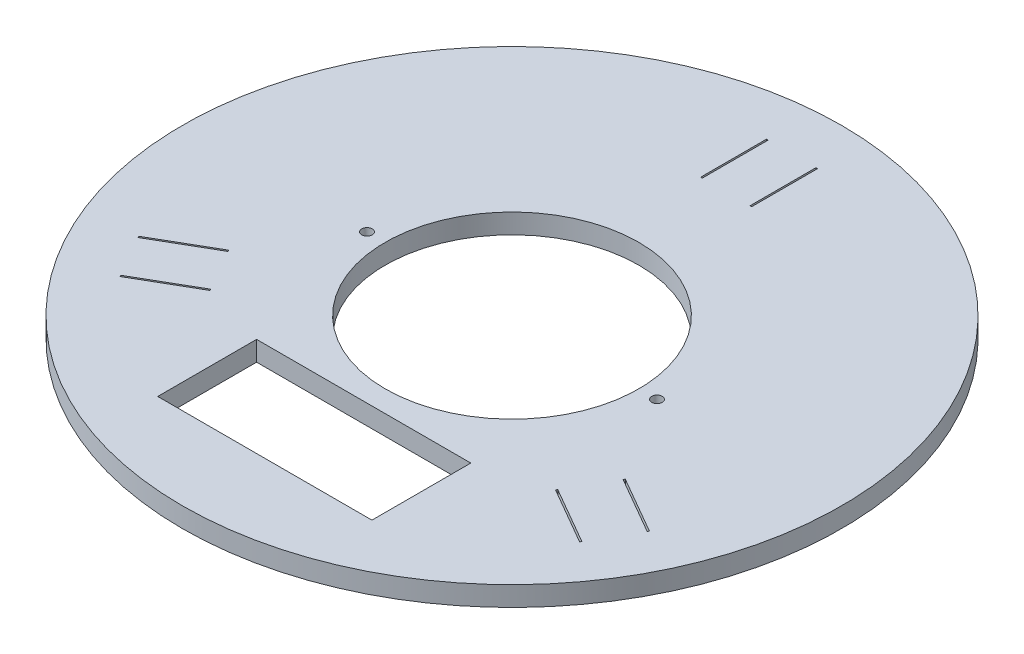
ISO-10303-21;
HEADER;
FILE_DESCRIPTION(('STEP AP214'),'2;1');
FILE_NAME('part.step','',(''),(''),'','','');
FILE_SCHEMA(('AUTOMOTIVE_DESIGN { 1 0 10303 214 1 1 1 1 }'));
ENDSEC;
DATA;
#1=APPLICATION_CONTEXT('core data for automotive mechanical design processes');
#2=APPLICATION_PROTOCOL_DEFINITION('international standard','automotive_design',2000,#1);
#3=PRODUCT_CONTEXT('',#1,'mechanical');
#4=PRODUCT('Part','Part','',(#3));
#5=PRODUCT_RELATED_PRODUCT_CATEGORY('part','',(#4));
#6=PRODUCT_DEFINITION_FORMATION('','',#4);
#7=PRODUCT_DEFINITION_CONTEXT('part definition',#1,'design');
#8=PRODUCT_DEFINITION('design','',#6,#7);
#9=PRODUCT_DEFINITION_SHAPE('','',#8);
#10=(LENGTH_UNIT() NAMED_UNIT(*) SI_UNIT(.MILLI.,.METRE.));
#11=(NAMED_UNIT(*) PLANE_ANGLE_UNIT() SI_UNIT($,.RADIAN.));
#12=(NAMED_UNIT(*) SI_UNIT($,.STERADIAN.) SOLID_ANGLE_UNIT());
#13=UNCERTAINTY_MEASURE_WITH_UNIT(LENGTH_MEASURE(1.E-05),#10,'distance_accuracy_value','');
#14=(GEOMETRIC_REPRESENTATION_CONTEXT(3) GLOBAL_UNCERTAINTY_ASSIGNED_CONTEXT((#13)) GLOBAL_UNIT_ASSIGNED_CONTEXT((#10,
#11,#12)) REPRESENTATION_CONTEXT('',''));
#15=CARTESIAN_POINT('',(0.,0.,0.));
#16=DIRECTION('',(0.,0.,1.));
#17=DIRECTION('',(1.,0.,0.));
#18=AXIS2_PLACEMENT_3D('',#15,#16,#17);
#19=CARTESIAN_POINT('',(0.,6.,0.));
#20=DIRECTION('',(0.,-1.,0.));
#21=DIRECTION('',(0.,0.,-1.));
#22=AXIS2_PLACEMENT_3D('',#19,#20,#21);
#23=CYLINDRICAL_SURFACE('',#22,100.);
#24=CARTESIAN_POINT('',(0.,6.,0.));
#25=DIRECTION('',(0.,1.,0.));
#26=DIRECTION('',(0.,0.,1.));
#27=AXIS2_PLACEMENT_3D('',#24,#25,#26);
#28=CIRCLE('',#27,100.);
#29=CARTESIAN_POINT('',(0.,6.,100.));
#30=VERTEX_POINT('',#29);
#31=EDGE_CURVE('E11',#30,#30,#28,.T.);
#32=ORIENTED_EDGE('',*,*,#31,.F.);
#33=EDGE_LOOP('',(#32));
#34=FACE_BOUND('',#33,.T.);
#35=CARTESIAN_POINT('',(0.,0.,0.));
#36=DIRECTION('',(0.,1.,0.));
#37=DIRECTION('',(0.,0.,1.));
#38=AXIS2_PLACEMENT_3D('',#35,#36,#37);
#39=CIRCLE('',#38,100.);
#40=CARTESIAN_POINT('',(0.,0.,100.));
#41=VERTEX_POINT('',#40);
#42=EDGE_CURVE('E42',#41,#41,#39,.T.);
#43=ORIENTED_EDGE('',*,*,#42,.T.);
#44=EDGE_LOOP('',(#43));
#45=FACE_BOUND('',#44,.T.);
#46=ADVANCED_FACE('F39',(#34,#45),#23,.T.);
#47=CARTESIAN_POINT('',(0.,6.,0.));
#48=DIRECTION('',(0.,1.,0.));
#49=DIRECTION('',(0.,0.,1.));
#50=AXIS2_PLACEMENT_3D('',#47,#48,#49);
#51=PLANE('',#50);
#52=DIRECTION('',(0.,0.,1.));
#53=VECTOR('',#52,1.);
#54=CARTESIAN_POINT('',(-32.5,6.,45.));
#55=LINE('',#54,#53);
#56=CARTESIAN_POINT('',(-32.5,6.,45.));
#57=VERTEX_POINT('',#56);
#58=CARTESIAN_POINT('',(-32.5,6.,75.));
#59=VERTEX_POINT('',#58);
#60=EDGE_CURVE('E53',#57,#59,#55,.T.);
#61=ORIENTED_EDGE('',*,*,#60,.F.);
#62=DIRECTION('',(-1.,0.,0.));
#63=VECTOR('',#62,1.);
#64=CARTESIAN_POINT('',(-32.5,6.,45.));
#65=LINE('',#64,#63);
#66=CARTESIAN_POINT('',(32.5,6.,45.));
#67=VERTEX_POINT('',#66);
#68=EDGE_CURVE('E241',#67,#57,#65,.T.);
#69=ORIENTED_EDGE('',*,*,#68,.F.);
#70=DIRECTION('',(0.,0.,-1.));
#71=VECTOR('',#70,1.);
#72=CARTESIAN_POINT('',(32.5,6.,45.));
#73=LINE('',#72,#71);
#74=CARTESIAN_POINT('',(32.5,6.,75.));
#75=VERTEX_POINT('',#74);
#76=EDGE_CURVE('E244',#75,#67,#73,.T.);
#77=ORIENTED_EDGE('',*,*,#76,.F.);
#78=DIRECTION('',(1.,0.,0.));
#79=VECTOR('',#78,1.);
#80=CARTESIAN_POINT('',(-32.5,6.,75.));
#81=LINE('',#80,#79);
#82=EDGE_CURVE('E250',#59,#75,#81,.T.);
#83=ORIENTED_EDGE('',*,*,#82,.F.);
#84=EDGE_LOOP('',(#61,#69,#77,#83));
#85=FACE_BOUND('',#84,.T.);
#86=CARTESIAN_POINT('',(-44.,6.,0.));
#87=DIRECTION('',(0.,1.,0.));
#88=DIRECTION('',(0.,0.,1.));
#89=AXIS2_PLACEMENT_3D('',#86,#87,#88);
#90=CIRCLE('',#89,1.6);
#91=CARTESIAN_POINT('',(-44.,6.,1.6));
#92=VERTEX_POINT('',#91);
#93=EDGE_CURVE('E264',#92,#92,#90,.T.);
#94=ORIENTED_EDGE('',*,*,#93,.F.);
#95=EDGE_LOOP('',(#94));
#96=FACE_BOUND('',#95,.T.);
#97=CARTESIAN_POINT('',(44.,6.,0.));
#98=DIRECTION('',(0.,1.,0.));
#99=DIRECTION('',(0.,0.,1.));
#100=AXIS2_PLACEMENT_3D('',#97,#98,#99);
#101=CIRCLE('',#100,1.6);
#102=CARTESIAN_POINT('',(44.,6.,1.6));
#103=VERTEX_POINT('',#102);
#104=EDGE_CURVE('E267',#103,#103,#101,.T.);
#105=ORIENTED_EDGE('',*,*,#104,.F.);
#106=EDGE_LOOP('',(#105));
#107=FACE_BOUND('',#106,.T.);
#108=CARTESIAN_POINT('',(0.,6.,0.));
#109=DIRECTION('',(0.,1.,0.));
#110=DIRECTION('',(0.,0.,1.));
#111=AXIS2_PLACEMENT_3D('',#108,#109,#110);
#112=CIRCLE('',#111,38.5);
#113=CARTESIAN_POINT('',(0.,6.,38.5));
#114=VERTEX_POINT('',#113);
#115=EDGE_CURVE('E263',#114,#114,#112,.T.);
#116=ORIENTED_EDGE('',*,*,#115,.F.);
#117=EDGE_LOOP('',(#116));
#118=FACE_BOUND('',#117,.T.);
#119=DIRECTION('',(0.,0.,-1.));
#120=VECTOR('',#119,1.);
#121=CARTESIAN_POINT('',(7.75,6.,-65.));
#122=LINE('',#121,#120);
#123=CARTESIAN_POINT('',(7.75,6.,-65.));
#124=VERTEX_POINT('',#123);
#125=CARTESIAN_POINT('',(7.75,6.,-85.));
#126=VERTEX_POINT('',#125);
#127=EDGE_CURVE('E331',#124,#126,#122,.T.);
#128=ORIENTED_EDGE('',*,*,#127,.F.);
#129=DIRECTION('',(1.,0.,0.));
#130=VECTOR('',#129,1.);
#131=CARTESIAN_POINT('',(7.25,6.,-65.));
#132=LINE('',#131,#130);
#133=CARTESIAN_POINT('',(7.25,6.,-65.));
#134=VERTEX_POINT('',#133);
#135=EDGE_CURVE('E321',#134,#124,#132,.T.);
#136=ORIENTED_EDGE('',*,*,#135,.F.);
#137=DIRECTION('',(0.,0.,1.));
#138=VECTOR('',#137,1.);
#139=CARTESIAN_POINT('',(7.25,6.,-65.));
#140=LINE('',#139,#138);
#141=CARTESIAN_POINT('',(7.25,6.,-85.));
#142=VERTEX_POINT('',#141);
#143=EDGE_CURVE('E324',#142,#134,#140,.T.);
#144=ORIENTED_EDGE('',*,*,#143,.F.);
#145=DIRECTION('',(-1.,0.,0.));
#146=VECTOR('',#145,1.);
#147=CARTESIAN_POINT('',(7.25,6.,-85.));
#148=LINE('',#147,#146);
#149=EDGE_CURVE('E328',#126,#142,#148,.T.);
#150=ORIENTED_EDGE('',*,*,#149,.F.);
#151=EDGE_LOOP('',(#128,#136,#144,#150));
#152=FACE_BOUND('',#151,.T.);
#153=DIRECTION('',(0.500000000000005,0.,-0.866025403784436));
#154=VECTOR('',#153,1.);
#155=CARTESIAN_POINT('',(77.4871593216773,6.,35.7883031206706));
#156=LINE('',#155,#154);
#157=CARTESIAN_POINT('',(77.2371593216773,6.,36.2213158225628));
#158=VERTEX_POINT('',#157);
#159=CARTESIAN_POINT('',(77.4871593216773,6.,35.7883031206706));
#160=VERTEX_POINT('',#159);
#161=EDGE_CURVE('E320',#158,#160,#156,.T.);
#162=ORIENTED_EDGE('',*,*,#161,.F.);
#163=DIRECTION('',(0.866025403784439,0.,0.5));
#164=VECTOR('',#163,1.);
#165=CARTESIAN_POINT('',(59.9166512459885,6.,26.2213158225628));
#166=LINE('',#165,#164);
#167=CARTESIAN_POINT('',(59.9166512459885,6.,26.2213158225628));
#168=VERTEX_POINT('',#167);
#169=EDGE_CURVE('E355',#168,#158,#166,.T.);
#170=ORIENTED_EDGE('',*,*,#169,.F.);
#171=DIRECTION('',(-0.500000000000005,0.,0.866025403784436));
#172=VECTOR('',#171,1.);
#173=CARTESIAN_POINT('',(60.1666512459885,6.,25.7883031206706));
#174=LINE('',#173,#172);
#175=CARTESIAN_POINT('',(60.1666512459885,6.,25.7883031206706));
#176=VERTEX_POINT('',#175);
#177=EDGE_CURVE('E358',#176,#168,#174,.T.);
#178=ORIENTED_EDGE('',*,*,#177,.F.);
#179=DIRECTION('',(-0.866025403784439,0.,-0.5));
#180=VECTOR('',#179,1.);
#181=CARTESIAN_POINT('',(60.1666512459885,6.,25.7883031206706));
#182=LINE('',#181,#180);
#183=EDGE_CURVE('E362',#160,#176,#182,.T.);
#184=ORIENTED_EDGE('',*,*,#183,.F.);
#185=EDGE_LOOP('',(#162,#170,#178,#184));
#186=FACE_BOUND('',#185,.T.);
#187=DIRECTION('',(0.499999999999998,0.,-0.866025403784439));
#188=VECTOR('',#187,1.);
#189=CARTESIAN_POINT('',(69.9871593216773,6.,48.7786841774372));
#190=LINE('',#189,#188);
#191=CARTESIAN_POINT('',(69.7371593216773,6.,49.2116968793294));
#192=VERTEX_POINT('',#191);
#193=CARTESIAN_POINT('',(69.9871593216773,6.,48.7786841774372));
#194=VERTEX_POINT('',#193);
#195=EDGE_CURVE('E354',#192,#194,#190,.T.);
#196=ORIENTED_EDGE('',*,*,#195,.F.);
#197=DIRECTION('',(0.866025403784438,0.,0.5));
#198=VECTOR('',#197,1.);
#199=CARTESIAN_POINT('',(52.4166512459885,6.,39.2116968793294));
#200=LINE('',#199,#198);
#201=CARTESIAN_POINT('',(52.4166512459885,6.,39.2116968793294));
#202=VERTEX_POINT('',#201);
#203=EDGE_CURVE('E387',#202,#192,#200,.T.);
#204=ORIENTED_EDGE('',*,*,#203,.F.);
#205=DIRECTION('',(-0.500000000000005,0.,0.866025403784436));
#206=VECTOR('',#205,1.);
#207=CARTESIAN_POINT('',(52.6666512459885,6.,38.7786841774372));
#208=LINE('',#207,#206);
#209=CARTESIAN_POINT('',(52.6666512459885,6.,38.7786841774372));
#210=VERTEX_POINT('',#209);
#211=EDGE_CURVE('E390',#210,#202,#208,.T.);
#212=ORIENTED_EDGE('',*,*,#211,.F.);
#213=DIRECTION('',(-0.866025403784439,0.,-0.5));
#214=VECTOR('',#213,1.);
#215=CARTESIAN_POINT('',(52.6666512459885,6.,38.7786841774372));
#216=LINE('',#215,#214);
#217=EDGE_CURVE('E394',#194,#210,#216,.T.);
#218=ORIENTED_EDGE('',*,*,#217,.F.);
#219=EDGE_LOOP('',(#196,#204,#212,#218));
#220=FACE_BOUND('',#219,.T.);
#221=DIRECTION('',(0.499999999999998,0.,0.866025403784439));
#222=VECTOR('',#221,1.);
#223=CARTESIAN_POINT('',(-69.7371593216772,6.,49.2116968793294));
#224=LINE('',#223,#222);
#225=CARTESIAN_POINT('',(-69.9871593216772,6.,48.7786841774372));
#226=VERTEX_POINT('',#225);
#227=CARTESIAN_POINT('',(-69.7371593216772,6.,49.2116968793294));
#228=VERTEX_POINT('',#227);
#229=EDGE_CURVE('E386',#226,#228,#224,.T.);
#230=ORIENTED_EDGE('',*,*,#229,.F.);
#231=DIRECTION('',(-0.866025403784438,0.,0.5));
#232=VECTOR('',#231,1.);
#233=CARTESIAN_POINT('',(-52.6666512459885,6.,38.7786841774372));
#234=LINE('',#233,#232);
#235=CARTESIAN_POINT('',(-52.6666512459885,6.,38.7786841774372));
#236=VERTEX_POINT('',#235);
#237=EDGE_CURVE('E417',#236,#226,#234,.T.);
#238=ORIENTED_EDGE('',*,*,#237,.F.);
#239=DIRECTION('',(-0.499999999999998,0.,-0.866025403784439));
#240=VECTOR('',#239,1.);
#241=CARTESIAN_POINT('',(-52.4166512459885,6.,39.2116968793294));
#242=LINE('',#241,#240);
#243=CARTESIAN_POINT('',(-52.4166512459885,6.,39.2116968793294));
#244=VERTEX_POINT('',#243);
#245=EDGE_CURVE('E420',#244,#236,#242,.T.);
#246=ORIENTED_EDGE('',*,*,#245,.F.);
#247=DIRECTION('',(0.866025403784438,0.,-0.5));
#248=VECTOR('',#247,1.);
#249=CARTESIAN_POINT('',(-52.4166512459885,6.,39.2116968793294));
#250=LINE('',#249,#248);
#251=EDGE_CURVE('E424',#228,#244,#250,.T.);
#252=ORIENTED_EDGE('',*,*,#251,.F.);
#253=EDGE_LOOP('',(#230,#238,#246,#252));
#254=FACE_BOUND('',#253,.T.);
#255=DIRECTION('',(0.499999999999998,0.,0.866025403784439));
#256=VECTOR('',#255,1.);
#257=CARTESIAN_POINT('',(-77.2371593216773,6.,36.2213158225629));
#258=LINE('',#257,#256);
#259=CARTESIAN_POINT('',(-77.4871593216773,6.,35.7883031206706));
#260=VERTEX_POINT('',#259);
#261=CARTESIAN_POINT('',(-77.2371593216773,6.,36.2213158225629));
#262=VERTEX_POINT('',#261);
#263=EDGE_CURVE('E297',#260,#262,#258,.T.);
#264=ORIENTED_EDGE('',*,*,#263,.F.);
#265=DIRECTION('',(-0.866025403784438,0.,0.5));
#266=VECTOR('',#265,1.);
#267=CARTESIAN_POINT('',(-60.1666512459885,6.,25.7883031206706));
#268=LINE('',#267,#266);
#269=CARTESIAN_POINT('',(-60.1666512459885,6.,25.7883031206706));
#270=VERTEX_POINT('',#269);
#271=EDGE_CURVE('E287',#270,#260,#268,.T.);
#272=ORIENTED_EDGE('',*,*,#271,.F.);
#273=DIRECTION('',(-0.500000000000005,0.,-0.866025403784436));
#274=VECTOR('',#273,1.);
#275=CARTESIAN_POINT('',(-59.9166512459885,6.,26.2213158225628));
#276=LINE('',#275,#274);
#277=CARTESIAN_POINT('',(-59.9166512459885,6.,26.2213158225628));
#278=VERTEX_POINT('',#277);
#279=EDGE_CURVE('E290',#278,#270,#276,.T.);
#280=ORIENTED_EDGE('',*,*,#279,.F.);
#281=DIRECTION('',(0.866025403784438,0.,-0.500000000000001));
#282=VECTOR('',#281,1.);
#283=CARTESIAN_POINT('',(-59.9166512459885,6.,26.2213158225628));
#284=LINE('',#283,#282);
#285=EDGE_CURVE('E294',#262,#278,#284,.T.);
#286=ORIENTED_EDGE('',*,*,#285,.F.);
#287=EDGE_LOOP('',(#264,#272,#280,#286));
#288=FACE_BOUND('',#287,.T.);
#289=DIRECTION('',(0.,0.,-1.));
#290=VECTOR('',#289,1.);
#291=CARTESIAN_POINT('',(-7.25,6.,-65.));
#292=LINE('',#291,#290);
#293=CARTESIAN_POINT('',(-7.25,6.,-65.));
#294=VERTEX_POINT('',#293);
#295=CARTESIAN_POINT('',(-7.25,6.,-85.));
#296=VERTEX_POINT('',#295);
#297=EDGE_CURVE('E333',#294,#296,#292,.T.);
#298=ORIENTED_EDGE('',*,*,#297,.F.);
#299=DIRECTION('',(1.,0.,0.));
#300=VECTOR('',#299,1.);
#301=CARTESIAN_POINT('',(-7.75,6.,-65.));
#302=LINE('',#301,#300);
#303=CARTESIAN_POINT('',(-7.75,6.,-65.));
#304=VERTEX_POINT('',#303);
#305=EDGE_CURVE('E442',#304,#294,#302,.T.);
#306=ORIENTED_EDGE('',*,*,#305,.F.);
#307=DIRECTION('',(0.,0.,1.));
#308=VECTOR('',#307,1.);
#309=CARTESIAN_POINT('',(-7.75,6.,-65.));
#310=LINE('',#309,#308);
#311=CARTESIAN_POINT('',(-7.75,6.,-85.));
#312=VERTEX_POINT('',#311);
#313=EDGE_CURVE('E456',#312,#304,#310,.T.);
#314=ORIENTED_EDGE('',*,*,#313,.F.);
#315=DIRECTION('',(-1.,0.,0.));
#316=VECTOR('',#315,1.);
#317=CARTESIAN_POINT('',(-7.75,6.,-85.));
#318=LINE('',#317,#316);
#319=EDGE_CURVE('E453',#296,#312,#318,.T.);
#320=ORIENTED_EDGE('',*,*,#319,.F.);
#321=EDGE_LOOP('',(#298,#306,#314,#320));
#322=FACE_BOUND('',#321,.T.);
#323=ORIENTED_EDGE('',*,*,#31,.T.);
#324=EDGE_LOOP('',(#323));
#325=FACE_BOUND('',#324,.T.);
#326=ADVANCED_FACE('F478',(#85,#96,#107,#118,#152,#186,#220,#254,#288,#322,#325),#51,.T.);
#327=CARTESIAN_POINT('',(0.,0.,0.));
#328=DIRECTION('',(0.,1.,0.));
#329=DIRECTION('',(0.,0.,1.));
#330=AXIS2_PLACEMENT_3D('',#327,#328,#329);
#331=PLANE('',#330);
#332=DIRECTION('',(-1.,0.,0.));
#333=VECTOR('',#332,1.);
#334=CARTESIAN_POINT('',(-32.5,0.,45.));
#335=LINE('',#334,#333);
#336=CARTESIAN_POINT('',(32.5,0.,45.));
#337=VERTEX_POINT('',#336);
#338=CARTESIAN_POINT('',(-32.5,0.,45.));
#339=VERTEX_POINT('',#338);
#340=EDGE_CURVE('E231',#337,#339,#335,.T.);
#341=ORIENTED_EDGE('',*,*,#340,.T.);
#342=DIRECTION('',(0.,0.,1.));
#343=VECTOR('',#342,1.);
#344=CARTESIAN_POINT('',(-32.5,0.,45.));
#345=LINE('',#344,#343);
#346=CARTESIAN_POINT('',(-32.5,0.,75.));
#347=VERTEX_POINT('',#346);
#348=EDGE_CURVE('E225',#339,#347,#345,.T.);
#349=ORIENTED_EDGE('',*,*,#348,.T.);
#350=DIRECTION('',(1.,0.,0.));
#351=VECTOR('',#350,1.);
#352=CARTESIAN_POINT('',(-32.5,0.,75.));
#353=LINE('',#352,#351);
#354=CARTESIAN_POINT('',(32.5,0.,75.));
#355=VERTEX_POINT('',#354);
#356=EDGE_CURVE('E234',#347,#355,#353,.T.);
#357=ORIENTED_EDGE('',*,*,#356,.T.);
#358=DIRECTION('',(0.,0.,-1.));
#359=VECTOR('',#358,1.);
#360=CARTESIAN_POINT('',(32.5,0.,45.));
#361=LINE('',#360,#359);
#362=EDGE_CURVE('E61',#355,#337,#361,.T.);
#363=ORIENTED_EDGE('',*,*,#362,.T.);
#364=EDGE_LOOP('',(#341,#349,#357,#363));
#365=FACE_BOUND('',#364,.T.);
#366=CARTESIAN_POINT('',(-44.,0.,0.));
#367=DIRECTION('',(0.,1.,0.));
#368=DIRECTION('',(0.,0.,1.));
#369=AXIS2_PLACEMENT_3D('',#366,#367,#368);
#370=CIRCLE('',#369,1.6);
#371=CARTESIAN_POINT('',(-44.,0.,1.6));
#372=VERTEX_POINT('',#371);
#373=EDGE_CURVE('E260',#372,#372,#370,.T.);
#374=ORIENTED_EDGE('',*,*,#373,.T.);
#375=EDGE_LOOP('',(#374));
#376=FACE_BOUND('',#375,.T.);
#377=CARTESIAN_POINT('',(44.,0.,0.));
#378=DIRECTION('',(0.,1.,0.));
#379=DIRECTION('',(0.,0.,1.));
#380=AXIS2_PLACEMENT_3D('',#377,#378,#379);
#381=CIRCLE('',#380,1.6);
#382=CARTESIAN_POINT('',(44.,0.,1.6));
#383=VERTEX_POINT('',#382);
#384=EDGE_CURVE('E256',#383,#383,#381,.T.);
#385=ORIENTED_EDGE('',*,*,#384,.T.);
#386=EDGE_LOOP('',(#385));
#387=FACE_BOUND('',#386,.T.);
#388=CARTESIAN_POINT('',(0.,0.,0.));
#389=DIRECTION('',(0.,1.,0.));
#390=DIRECTION('',(0.,0.,1.));
#391=AXIS2_PLACEMENT_3D('',#388,#389,#390);
#392=CIRCLE('',#391,38.5);
#393=CARTESIAN_POINT('',(0.,0.,38.5));
#394=VERTEX_POINT('',#393);
#395=EDGE_CURVE('E272',#394,#394,#392,.T.);
#396=ORIENTED_EDGE('',*,*,#395,.T.);
#397=EDGE_LOOP('',(#396));
#398=FACE_BOUND('',#397,.T.);
#399=DIRECTION('',(1.,0.,0.));
#400=VECTOR('',#399,1.);
#401=CARTESIAN_POINT('',(7.25,0.,-65.));
#402=LINE('',#401,#400);
#403=CARTESIAN_POINT('',(7.25,0.,-65.));
#404=VERTEX_POINT('',#403);
#405=CARTESIAN_POINT('',(7.75,0.,-65.));
#406=VERTEX_POINT('',#405);
#407=EDGE_CURVE('E313',#404,#406,#402,.T.);
#408=ORIENTED_EDGE('',*,*,#407,.T.);
#409=DIRECTION('',(0.,0.,-1.));
#410=VECTOR('',#409,1.);
#411=CARTESIAN_POINT('',(7.75,0.,-65.));
#412=LINE('',#411,#410);
#413=CARTESIAN_POINT('',(7.75,0.,-85.));
#414=VERTEX_POINT('',#413);
#415=EDGE_CURVE('E325',#406,#414,#412,.T.);
#416=ORIENTED_EDGE('',*,*,#415,.T.);
#417=DIRECTION('',(-1.,0.,0.));
#418=VECTOR('',#417,1.);
#419=CARTESIAN_POINT('',(7.25,0.,-85.));
#420=LINE('',#419,#418);
#421=CARTESIAN_POINT('',(7.25,0.,-85.));
#422=VERTEX_POINT('',#421);
#423=EDGE_CURVE('E339',#414,#422,#420,.T.);
#424=ORIENTED_EDGE('',*,*,#423,.T.);
#425=DIRECTION('',(0.,0.,1.));
#426=VECTOR('',#425,1.);
#427=CARTESIAN_POINT('',(7.25,0.,-65.));
#428=LINE('',#427,#426);
#429=EDGE_CURVE('E336',#422,#404,#428,.T.);
#430=ORIENTED_EDGE('',*,*,#429,.T.);
#431=EDGE_LOOP('',(#408,#416,#424,#430));
#432=FACE_BOUND('',#431,.T.);
#433=DIRECTION('',(0.866025403784439,0.,0.5));
#434=VECTOR('',#433,1.);
#435=CARTESIAN_POINT('',(59.9166512459885,0.,26.2213158225628));
#436=LINE('',#435,#434);
#437=CARTESIAN_POINT('',(59.9166512459885,0.,26.2213158225628));
#438=VERTEX_POINT('',#437);
#439=CARTESIAN_POINT('',(77.2371593216773,0.,36.2213158225628));
#440=VERTEX_POINT('',#439);
#441=EDGE_CURVE('E347',#438,#440,#436,.T.);
#442=ORIENTED_EDGE('',*,*,#441,.T.);
#443=DIRECTION('',(0.500000000000005,0.,-0.866025403784436));
#444=VECTOR('',#443,1.);
#445=CARTESIAN_POINT('',(77.4871593216773,0.,35.7883031206706));
#446=LINE('',#445,#444);
#447=CARTESIAN_POINT('',(77.4871593216773,0.,35.7883031206706));
#448=VERTEX_POINT('',#447);
#449=EDGE_CURVE('E359',#440,#448,#446,.T.);
#450=ORIENTED_EDGE('',*,*,#449,.T.);
#451=DIRECTION('',(-0.866025403784439,0.,-0.5));
#452=VECTOR('',#451,1.);
#453=CARTESIAN_POINT('',(60.1666512459885,0.,25.7883031206706));
#454=LINE('',#453,#452);
#455=CARTESIAN_POINT('',(60.1666512459885,0.,25.7883031206706));
#456=VERTEX_POINT('',#455);
#457=EDGE_CURVE('E371',#448,#456,#454,.T.);
#458=ORIENTED_EDGE('',*,*,#457,.T.);
#459=DIRECTION('',(-0.500000000000005,0.,0.866025403784436));
#460=VECTOR('',#459,1.);
#461=CARTESIAN_POINT('',(60.1666512459885,0.,25.7883031206706));
#462=LINE('',#461,#460);
#463=EDGE_CURVE('E368',#456,#438,#462,.T.);
#464=ORIENTED_EDGE('',*,*,#463,.T.);
#465=EDGE_LOOP('',(#442,#450,#458,#464));
#466=FACE_BOUND('',#465,.T.);
#467=DIRECTION('',(0.866025403784438,0.,0.5));
#468=VECTOR('',#467,1.);
#469=CARTESIAN_POINT('',(52.4166512459885,0.,39.2116968793294));
#470=LINE('',#469,#468);
#471=CARTESIAN_POINT('',(52.4166512459885,0.,39.2116968793294));
#472=VERTEX_POINT('',#471);
#473=CARTESIAN_POINT('',(69.7371593216773,0.,49.2116968793294));
#474=VERTEX_POINT('',#473);
#475=EDGE_CURVE('E379',#472,#474,#470,.T.);
#476=ORIENTED_EDGE('',*,*,#475,.T.);
#477=DIRECTION('',(0.499999999999998,0.,-0.866025403784439));
#478=VECTOR('',#477,1.);
#479=CARTESIAN_POINT('',(69.9871593216773,0.,48.7786841774372));
#480=LINE('',#479,#478);
#481=CARTESIAN_POINT('',(69.9871593216773,0.,48.7786841774372));
#482=VERTEX_POINT('',#481);
#483=EDGE_CURVE('E391',#474,#482,#480,.T.);
#484=ORIENTED_EDGE('',*,*,#483,.T.);
#485=DIRECTION('',(-0.866025403784439,0.,-0.5));
#486=VECTOR('',#485,1.);
#487=CARTESIAN_POINT('',(52.6666512459885,0.,38.7786841774372));
#488=LINE('',#487,#486);
#489=CARTESIAN_POINT('',(52.6666512459885,0.,38.7786841774372));
#490=VERTEX_POINT('',#489);
#491=EDGE_CURVE('E403',#482,#490,#488,.T.);
#492=ORIENTED_EDGE('',*,*,#491,.T.);
#493=DIRECTION('',(-0.500000000000005,0.,0.866025403784436));
#494=VECTOR('',#493,1.);
#495=CARTESIAN_POINT('',(52.6666512459885,0.,38.7786841774372));
#496=LINE('',#495,#494);
#497=EDGE_CURVE('E400',#490,#472,#496,.T.);
#498=ORIENTED_EDGE('',*,*,#497,.T.);
#499=EDGE_LOOP('',(#476,#484,#492,#498));
#500=FACE_BOUND('',#499,.T.);
#501=DIRECTION('',(-0.866025403784438,0.,0.5));
#502=VECTOR('',#501,1.);
#503=CARTESIAN_POINT('',(-52.6666512459885,0.,38.7786841774372));
#504=LINE('',#503,#502);
#505=CARTESIAN_POINT('',(-52.6666512459885,0.,38.7786841774372));
#506=VERTEX_POINT('',#505);
#507=CARTESIAN_POINT('',(-69.9871593216772,0.,48.7786841774372));
#508=VERTEX_POINT('',#507);
#509=EDGE_CURVE('E411',#506,#508,#504,.T.);
#510=ORIENTED_EDGE('',*,*,#509,.T.);
#511=DIRECTION('',(0.499999999999998,0.,0.866025403784439));
#512=VECTOR('',#511,1.);
#513=CARTESIAN_POINT('',(-69.7371593216772,0.,49.2116968793294));
#514=LINE('',#513,#512);
#515=CARTESIAN_POINT('',(-69.7371593216772,0.,49.2116968793294));
#516=VERTEX_POINT('',#515);
#517=EDGE_CURVE('E421',#508,#516,#514,.T.);
#518=ORIENTED_EDGE('',*,*,#517,.T.);
#519=DIRECTION('',(0.866025403784438,0.,-0.5));
#520=VECTOR('',#519,1.);
#521=CARTESIAN_POINT('',(-52.4166512459885,0.,39.2116968793294));
#522=LINE('',#521,#520);
#523=CARTESIAN_POINT('',(-52.4166512459885,0.,39.2116968793294));
#524=VERTEX_POINT('',#523);
#525=EDGE_CURVE('E433',#516,#524,#522,.T.);
#526=ORIENTED_EDGE('',*,*,#525,.T.);
#527=DIRECTION('',(-0.499999999999998,0.,-0.866025403784439));
#528=VECTOR('',#527,1.);
#529=CARTESIAN_POINT('',(-52.4166512459885,0.,39.2116968793294));
#530=LINE('',#529,#528);
#531=EDGE_CURVE('E430',#524,#506,#530,.T.);
#532=ORIENTED_EDGE('',*,*,#531,.T.);
#533=EDGE_LOOP('',(#510,#518,#526,#532));
#534=FACE_BOUND('',#533,.T.);
#535=DIRECTION('',(-0.866025403784438,0.,0.5));
#536=VECTOR('',#535,1.);
#537=CARTESIAN_POINT('',(-60.1666512459885,0.,25.7883031206706));
#538=LINE('',#537,#536);
#539=CARTESIAN_POINT('',(-60.1666512459885,0.,25.7883031206706));
#540=VERTEX_POINT('',#539);
#541=CARTESIAN_POINT('',(-77.4871593216773,0.,35.7883031206706));
#542=VERTEX_POINT('',#541);
#543=EDGE_CURVE('E281',#540,#542,#538,.T.);
#544=ORIENTED_EDGE('',*,*,#543,.T.);
#545=DIRECTION('',(0.499999999999998,0.,0.866025403784439));
#546=VECTOR('',#545,1.);
#547=CARTESIAN_POINT('',(-77.2371593216773,0.,36.2213158225629));
#548=LINE('',#547,#546);
#549=CARTESIAN_POINT('',(-77.2371593216773,0.,36.2213158225629));
#550=VERTEX_POINT('',#549);
#551=EDGE_CURVE('E291',#542,#550,#548,.T.);
#552=ORIENTED_EDGE('',*,*,#551,.T.);
#553=DIRECTION('',(0.866025403784438,0.,-0.500000000000001));
#554=VECTOR('',#553,1.);
#555=CARTESIAN_POINT('',(-59.9166512459885,0.,26.2213158225628));
#556=LINE('',#555,#554);
#557=CARTESIAN_POINT('',(-59.9166512459885,0.,26.2213158225628));
#558=VERTEX_POINT('',#557);
#559=EDGE_CURVE('E305',#550,#558,#556,.T.);
#560=ORIENTED_EDGE('',*,*,#559,.T.);
#561=DIRECTION('',(-0.500000000000005,0.,-0.866025403784436));
#562=VECTOR('',#561,1.);
#563=CARTESIAN_POINT('',(-59.9166512459885,0.,26.2213158225628));
#564=LINE('',#563,#562);
#565=EDGE_CURVE('E302',#558,#540,#564,.T.);
#566=ORIENTED_EDGE('',*,*,#565,.T.);
#567=EDGE_LOOP('',(#544,#552,#560,#566));
#568=FACE_BOUND('',#567,.T.);
#569=DIRECTION('',(1.,0.,0.));
#570=VECTOR('',#569,1.);
#571=CARTESIAN_POINT('',(-7.75,0.,-65.));
#572=LINE('',#571,#570);
#573=CARTESIAN_POINT('',(-7.75,0.,-65.));
#574=VERTEX_POINT('',#573);
#575=CARTESIAN_POINT('',(-7.25,0.,-65.));
#576=VERTEX_POINT('',#575);
#577=EDGE_CURVE('E448',#574,#576,#572,.T.);
#578=ORIENTED_EDGE('',*,*,#577,.T.);
#579=DIRECTION('',(0.,0.,-1.));
#580=VECTOR('',#579,1.);
#581=CARTESIAN_POINT('',(-7.25,0.,-65.));
#582=LINE('',#581,#580);
#583=CARTESIAN_POINT('',(-7.25,0.,-85.));
#584=VERTEX_POINT('',#583);
#585=EDGE_CURVE('E438',#576,#584,#582,.T.);
#586=ORIENTED_EDGE('',*,*,#585,.T.);
#587=DIRECTION('',(-1.,0.,0.));
#588=VECTOR('',#587,1.);
#589=CARTESIAN_POINT('',(-7.75,0.,-85.));
#590=LINE('',#589,#588);
#591=CARTESIAN_POINT('',(-7.75,0.,-85.));
#592=VERTEX_POINT('',#591);
#593=EDGE_CURVE('E441',#584,#592,#590,.T.);
#594=ORIENTED_EDGE('',*,*,#593,.T.);
#595=DIRECTION('',(0.,0.,1.));
#596=VECTOR('',#595,1.);
#597=CARTESIAN_POINT('',(-7.75,0.,-65.));
#598=LINE('',#597,#596);
#599=EDGE_CURVE('E445',#592,#574,#598,.T.);
#600=ORIENTED_EDGE('',*,*,#599,.T.);
#601=EDGE_LOOP('',(#578,#586,#594,#600));
#602=FACE_BOUND('',#601,.T.);
#603=ORIENTED_EDGE('',*,*,#42,.F.);
#604=EDGE_LOOP('',(#603));
#605=FACE_BOUND('',#604,.T.);
#606=ADVANCED_FACE('F238',(#365,#376,#387,#398,#432,#466,#500,#534,#568,#602,#605),#331,.F.);
#607=CARTESIAN_POINT('',(-7.25,0.,-65.));
#608=DIRECTION('',(1.,0.,0.));
#609=DIRECTION('',(0.,0.,-1.));
#610=AXIS2_PLACEMENT_3D('',#607,#608,#609);
#611=PLANE('',#610);
#612=ORIENTED_EDGE('',*,*,#297,.T.);
#613=DIRECTION('',(0.,1.,0.));
#614=VECTOR('',#613,1.);
#615=CARTESIAN_POINT('',(-7.25,0.,-85.));
#616=LINE('',#615,#614);
#617=EDGE_CURVE('E451',#584,#296,#616,.T.);
#618=ORIENTED_EDGE('',*,*,#617,.F.);
#619=ORIENTED_EDGE('',*,*,#585,.F.);
#620=DIRECTION('',(0.,1.,0.));
#621=VECTOR('',#620,1.);
#622=CARTESIAN_POINT('',(-7.25,0.,-65.));
#623=LINE('',#622,#621);
#624=EDGE_CURVE('E461',#576,#294,#623,.T.);
#625=ORIENTED_EDGE('',*,*,#624,.T.);
#626=EDGE_LOOP('',(#612,#618,#619,#625));
#627=FACE_BOUND('',#626,.T.);
#628=ADVANCED_FACE('F486',(#627),#611,.F.);
#629=CARTESIAN_POINT('',(-7.75,0.,-65.));
#630=DIRECTION('',(0.,0.,1.));
#631=DIRECTION('',(1.,0.,0.));
#632=AXIS2_PLACEMENT_3D('',#629,#630,#631);
#633=PLANE('',#632);
#634=ORIENTED_EDGE('',*,*,#305,.T.);
#635=ORIENTED_EDGE('',*,*,#624,.F.);
#636=ORIENTED_EDGE('',*,*,#577,.F.);
#637=DIRECTION('',(0.,1.,0.));
#638=VECTOR('',#637,1.);
#639=CARTESIAN_POINT('',(-7.75,0.,-65.));
#640=LINE('',#639,#638);
#641=EDGE_CURVE('E463',#574,#304,#640,.T.);
#642=ORIENTED_EDGE('',*,*,#641,.T.);
#643=EDGE_LOOP('',(#634,#635,#636,#642));
#644=FACE_BOUND('',#643,.T.);
#645=ADVANCED_FACE('F488',(#644),#633,.F.);
#646=CARTESIAN_POINT('',(-7.75,0.,-65.));
#647=DIRECTION('',(-1.,0.,0.));
#648=DIRECTION('',(0.,0.,1.));
#649=AXIS2_PLACEMENT_3D('',#646,#647,#648);
#650=PLANE('',#649);
#651=ORIENTED_EDGE('',*,*,#313,.T.);
#652=ORIENTED_EDGE('',*,*,#641,.F.);
#653=ORIENTED_EDGE('',*,*,#599,.F.);
#654=DIRECTION('',(0.,1.,0.));
#655=VECTOR('',#654,1.);
#656=CARTESIAN_POINT('',(-7.75,0.,-85.));
#657=LINE('',#656,#655);
#658=EDGE_CURVE('E465',#592,#312,#657,.T.);
#659=ORIENTED_EDGE('',*,*,#658,.T.);
#660=EDGE_LOOP('',(#651,#652,#653,#659));
#661=FACE_BOUND('',#660,.T.);
#662=ADVANCED_FACE('F482',(#661),#650,.F.);
#663=CARTESIAN_POINT('',(-7.75,0.,-85.));
#664=DIRECTION('',(0.,0.,-1.));
#665=DIRECTION('',(-1.,0.,0.));
#666=AXIS2_PLACEMENT_3D('',#663,#664,#665);
#667=PLANE('',#666);
#668=ORIENTED_EDGE('',*,*,#319,.T.);
#669=ORIENTED_EDGE('',*,*,#658,.F.);
#670=ORIENTED_EDGE('',*,*,#593,.F.);
#671=ORIENTED_EDGE('',*,*,#617,.T.);
#672=EDGE_LOOP('',(#668,#669,#670,#671));
#673=FACE_BOUND('',#672,.T.);
#674=ADVANCED_FACE('F471',(#673),#667,.F.);
#675=CARTESIAN_POINT('',(-77.2371593216773,0.,36.2213158225629));
#676=DIRECTION('',(-0.866025403784439,0.,0.499999999999999));
#677=DIRECTION('',(0.499999999999999,0.,0.866025403784439));
#678=AXIS2_PLACEMENT_3D('',#675,#676,#677);
#679=PLANE('',#678);
#680=ORIENTED_EDGE('',*,*,#263,.T.);
#681=DIRECTION('',(0.,1.,0.));
#682=VECTOR('',#681,1.);
#683=CARTESIAN_POINT('',(-77.2371593216773,0.,36.2213158225629));
#684=LINE('',#683,#682);
#685=EDGE_CURVE('E278',#550,#262,#684,.T.);
#686=ORIENTED_EDGE('',*,*,#685,.F.);
#687=ORIENTED_EDGE('',*,*,#551,.F.);
#688=DIRECTION('',(0.,1.,0.));
#689=VECTOR('',#688,1.);
#690=CARTESIAN_POINT('',(-77.4871593216773,0.,35.7883031206706));
#691=LINE('',#690,#689);
#692=EDGE_CURVE('E275',#542,#260,#691,.T.);
#693=ORIENTED_EDGE('',*,*,#692,.T.);
#694=EDGE_LOOP('',(#680,#686,#687,#693));
#695=FACE_BOUND('',#694,.T.);
#696=ADVANCED_FACE('F515',(#695),#679,.F.);
#697=CARTESIAN_POINT('',(-60.1666512459885,0.,25.7883031206706));
#698=DIRECTION('',(-0.5,0.,-0.866025403784438));
#699=DIRECTION('',(-0.866025403784439,0.,0.5));
#700=AXIS2_PLACEMENT_3D('',#697,#698,#699);
#701=PLANE('',#700);
#702=ORIENTED_EDGE('',*,*,#271,.T.);
#703=ORIENTED_EDGE('',*,*,#692,.F.);
#704=ORIENTED_EDGE('',*,*,#543,.F.);
#705=DIRECTION('',(0.,1.,0.));
#706=VECTOR('',#705,1.);
#707=CARTESIAN_POINT('',(-60.1666512459885,0.,25.7883031206706));
#708=LINE('',#707,#706);
#709=EDGE_CURVE('E284',#540,#270,#708,.T.);
#710=ORIENTED_EDGE('',*,*,#709,.T.);
#711=EDGE_LOOP('',(#702,#703,#704,#710));
#712=FACE_BOUND('',#711,.T.);
#713=ADVANCED_FACE('F519',(#712),#701,.F.);
#714=CARTESIAN_POINT('',(-59.9166512459885,0.,26.2213158225628));
#715=DIRECTION('',(0.866025403784436,0.,-0.500000000000005));
#716=DIRECTION('',(-0.500000000000005,0.,-0.866025403784436));
#717=AXIS2_PLACEMENT_3D('',#714,#715,#716);
#718=PLANE('',#717);
#719=ORIENTED_EDGE('',*,*,#279,.T.);
#720=ORIENTED_EDGE('',*,*,#709,.F.);
#721=ORIENTED_EDGE('',*,*,#565,.F.);
#722=DIRECTION('',(0.,1.,0.));
#723=VECTOR('',#722,1.);
#724=CARTESIAN_POINT('',(-59.9166512459885,0.,26.2213158225628));
#725=LINE('',#724,#723);
#726=EDGE_CURVE('E282',#558,#278,#725,.T.);
#727=ORIENTED_EDGE('',*,*,#726,.T.);
#728=EDGE_LOOP('',(#719,#720,#721,#727));
#729=FACE_BOUND('',#728,.T.);
#730=ADVANCED_FACE('F525',(#729),#718,.F.);
#731=CARTESIAN_POINT('',(-59.9166512459885,0.,26.2213158225628));
#732=DIRECTION('',(0.500000000000001,0.,0.866025403784438));
#733=DIRECTION('',(0.866025403784438,0.,-0.500000000000001));
#734=AXIS2_PLACEMENT_3D('',#731,#732,#733);
#735=PLANE('',#734);
#736=ORIENTED_EDGE('',*,*,#285,.T.);
#737=ORIENTED_EDGE('',*,*,#726,.F.);
#738=ORIENTED_EDGE('',*,*,#559,.F.);
#739=ORIENTED_EDGE('',*,*,#685,.T.);
#740=EDGE_LOOP('',(#736,#737,#738,#739));
#741=FACE_BOUND('',#740,.T.);
#742=ADVANCED_FACE('F532',(#741),#735,.F.);
#743=CARTESIAN_POINT('',(-69.7371593216772,0.,49.2116968793294));
#744=DIRECTION('',(-0.866025403784439,0.,0.499999999999999));
#745=DIRECTION('',(0.499999999999999,0.,0.866025403784439));
#746=AXIS2_PLACEMENT_3D('',#743,#744,#745);
#747=PLANE('',#746);
#748=ORIENTED_EDGE('',*,*,#229,.T.);
#749=DIRECTION('',(0.,1.,0.));
#750=VECTOR('',#749,1.);
#751=CARTESIAN_POINT('',(-69.7371593216772,0.,49.2116968793294));
#752=LINE('',#751,#750);
#753=EDGE_CURVE('E408',#516,#228,#752,.T.);
#754=ORIENTED_EDGE('',*,*,#753,.F.);
#755=ORIENTED_EDGE('',*,*,#517,.F.);
#756=DIRECTION('',(0.,1.,0.));
#757=VECTOR('',#756,1.);
#758=CARTESIAN_POINT('',(-69.9871593216772,0.,48.7786841774372));
#759=LINE('',#758,#757);
#760=EDGE_CURVE('E299',#508,#226,#759,.T.);
#761=ORIENTED_EDGE('',*,*,#760,.T.);
#762=EDGE_LOOP('',(#748,#754,#755,#761));
#763=FACE_BOUND('',#762,.T.);
#764=ADVANCED_FACE('F535',(#763),#747,.F.);
#765=CARTESIAN_POINT('',(-52.6666512459885,0.,38.7786841774372));
#766=DIRECTION('',(-0.500000000000001,0.,-0.866025403784438));
#767=DIRECTION('',(-0.866025403784438,0.,0.500000000000001));
#768=AXIS2_PLACEMENT_3D('',#765,#766,#767);
#769=PLANE('',#768);
#770=ORIENTED_EDGE('',*,*,#237,.T.);
#771=ORIENTED_EDGE('',*,*,#760,.F.);
#772=ORIENTED_EDGE('',*,*,#509,.F.);
#773=DIRECTION('',(0.,1.,0.));
#774=VECTOR('',#773,1.);
#775=CARTESIAN_POINT('',(-52.6666512459885,0.,38.7786841774372));
#776=LINE('',#775,#774);
#777=EDGE_CURVE('E414',#506,#236,#776,.T.);
#778=ORIENTED_EDGE('',*,*,#777,.T.);
#779=EDGE_LOOP('',(#770,#771,#772,#778));
#780=FACE_BOUND('',#779,.T.);
#781=ADVANCED_FACE('F591',(#780),#769,.F.);
#782=CARTESIAN_POINT('',(-52.4166512459885,0.,39.2116968793294));
#783=DIRECTION('',(0.866025403784439,0.,-0.499999999999999));
#784=DIRECTION('',(-0.499999999999999,0.,-0.866025403784439));
#785=AXIS2_PLACEMENT_3D('',#782,#783,#784);
#786=PLANE('',#785);
#787=ORIENTED_EDGE('',*,*,#245,.T.);
#788=ORIENTED_EDGE('',*,*,#777,.F.);
#789=ORIENTED_EDGE('',*,*,#531,.F.);
#790=DIRECTION('',(0.,1.,0.));
#791=VECTOR('',#790,1.);
#792=CARTESIAN_POINT('',(-52.4166512459885,0.,39.2116968793294));
#793=LINE('',#792,#791);
#794=EDGE_CURVE('E412',#524,#244,#793,.T.);
#795=ORIENTED_EDGE('',*,*,#794,.T.);
#796=EDGE_LOOP('',(#787,#788,#789,#795));
#797=FACE_BOUND('',#796,.T.);
#798=ADVANCED_FACE('F595',(#797),#786,.F.);
#799=CARTESIAN_POINT('',(-52.4166512459885,0.,39.2116968793294));
#800=DIRECTION('',(0.500000000000001,0.,0.866025403784438));
#801=DIRECTION('',(0.866025403784438,0.,-0.500000000000001));
#802=AXIS2_PLACEMENT_3D('',#799,#800,#801);
#803=PLANE('',#802);
#804=ORIENTED_EDGE('',*,*,#251,.T.);
#805=ORIENTED_EDGE('',*,*,#794,.F.);
#806=ORIENTED_EDGE('',*,*,#525,.F.);
#807=ORIENTED_EDGE('',*,*,#753,.T.);
#808=EDGE_LOOP('',(#804,#805,#806,#807));
#809=FACE_BOUND('',#808,.T.);
#810=ADVANCED_FACE('F577',(#809),#803,.F.);
#811=CARTESIAN_POINT('',(69.9871593216773,0.,48.7786841774372));
#812=DIRECTION('',(0.866025403784439,0.,0.499999999999999));
#813=DIRECTION('',(0.499999999999999,0.,-0.866025403784439));
#814=AXIS2_PLACEMENT_3D('',#811,#812,#813);
#815=PLANE('',#814);
#816=ORIENTED_EDGE('',*,*,#195,.T.);
#817=DIRECTION('',(0.,1.,0.));
#818=VECTOR('',#817,1.);
#819=CARTESIAN_POINT('',(69.9871593216773,0.,48.7786841774372));
#820=LINE('',#819,#818);
#821=EDGE_CURVE('E376',#482,#194,#820,.T.);
#822=ORIENTED_EDGE('',*,*,#821,.F.);
#823=ORIENTED_EDGE('',*,*,#483,.F.);
#824=DIRECTION('',(0.,1.,0.));
#825=VECTOR('',#824,1.);
#826=CARTESIAN_POINT('',(69.7371593216773,0.,49.2116968793294));
#827=LINE('',#826,#825);
#828=EDGE_CURVE('E384',#474,#192,#827,.T.);
#829=ORIENTED_EDGE('',*,*,#828,.T.);
#830=EDGE_LOOP('',(#816,#822,#823,#829));
#831=FACE_BOUND('',#830,.T.);
#832=ADVANCED_FACE('F573',(#831),#815,.F.);
#833=CARTESIAN_POINT('',(52.4166512459885,0.,39.2116968793294));
#834=DIRECTION('',(-0.5,0.,0.866025403784438));
#835=DIRECTION('',(0.866025403784439,0.,0.5));
#836=AXIS2_PLACEMENT_3D('',#833,#834,#835);
#837=PLANE('',#836);
#838=ORIENTED_EDGE('',*,*,#203,.T.);
#839=ORIENTED_EDGE('',*,*,#828,.F.);
#840=ORIENTED_EDGE('',*,*,#475,.F.);
#841=DIRECTION('',(0.,1.,0.));
#842=VECTOR('',#841,1.);
#843=CARTESIAN_POINT('',(52.4166512459885,0.,39.2116968793294));
#844=LINE('',#843,#842);
#845=EDGE_CURVE('E382',#472,#202,#844,.T.);
#846=ORIENTED_EDGE('',*,*,#845,.T.);
#847=EDGE_LOOP('',(#838,#839,#840,#846));
#848=FACE_BOUND('',#847,.T.);
#849=ADVANCED_FACE('F576',(#848),#837,.F.);
#850=CARTESIAN_POINT('',(52.6666512459885,0.,38.7786841774372));
#851=DIRECTION('',(-0.866025403784436,0.,-0.500000000000005));
#852=DIRECTION('',(-0.500000000000005,0.,0.866025403784436));
#853=AXIS2_PLACEMENT_3D('',#850,#851,#852);
#854=PLANE('',#853);
#855=ORIENTED_EDGE('',*,*,#211,.T.);
#856=ORIENTED_EDGE('',*,*,#845,.F.);
#857=ORIENTED_EDGE('',*,*,#497,.F.);
#858=DIRECTION('',(0.,1.,0.));
#859=VECTOR('',#858,1.);
#860=CARTESIAN_POINT('',(52.6666512459885,0.,38.7786841774372));
#861=LINE('',#860,#859);
#862=EDGE_CURVE('E380',#490,#210,#861,.T.);
#863=ORIENTED_EDGE('',*,*,#862,.T.);
#864=EDGE_LOOP('',(#855,#856,#857,#863));
#865=FACE_BOUND('',#864,.T.);
#866=ADVANCED_FACE('F581',(#865),#854,.F.);
#867=CARTESIAN_POINT('',(52.6666512459885,0.,38.7786841774372));
#868=DIRECTION('',(0.5,0.,-0.866025403784438));
#869=DIRECTION('',(-0.866025403784439,0.,-0.5));
#870=AXIS2_PLACEMENT_3D('',#867,#868,#869);
#871=PLANE('',#870);
#872=ORIENTED_EDGE('',*,*,#217,.T.);
#873=ORIENTED_EDGE('',*,*,#862,.F.);
#874=ORIENTED_EDGE('',*,*,#491,.F.);
#875=ORIENTED_EDGE('',*,*,#821,.T.);
#876=EDGE_LOOP('',(#872,#873,#874,#875));
#877=FACE_BOUND('',#876,.T.);
#878=ADVANCED_FACE('F561',(#877),#871,.F.);
#879=CARTESIAN_POINT('',(77.4871593216773,0.,35.7883031206706));
#880=DIRECTION('',(0.866025403784436,0.,0.500000000000005));
#881=DIRECTION('',(0.500000000000005,0.,-0.866025403784436));
#882=AXIS2_PLACEMENT_3D('',#879,#880,#881);
#883=PLANE('',#882);
#884=ORIENTED_EDGE('',*,*,#161,.T.);
#885=DIRECTION('',(0.,1.,0.));
#886=VECTOR('',#885,1.);
#887=CARTESIAN_POINT('',(77.4871593216773,0.,35.7883031206706));
#888=LINE('',#887,#886);
#889=EDGE_CURVE('E344',#448,#160,#888,.T.);
#890=ORIENTED_EDGE('',*,*,#889,.F.);
#891=ORIENTED_EDGE('',*,*,#449,.F.);
#892=DIRECTION('',(0.,1.,0.));
#893=VECTOR('',#892,1.);
#894=CARTESIAN_POINT('',(77.2371593216773,0.,36.2213158225628));
#895=LINE('',#894,#893);
#896=EDGE_CURVE('E352',#440,#158,#895,.T.);
#897=ORIENTED_EDGE('',*,*,#896,.T.);
#898=EDGE_LOOP('',(#884,#890,#891,#897));
#899=FACE_BOUND('',#898,.T.);
#900=ADVANCED_FACE('F557',(#899),#883,.F.);
#901=CARTESIAN_POINT('',(59.9166512459885,0.,26.2213158225628));
#902=DIRECTION('',(-0.5,0.,0.866025403784439));
#903=DIRECTION('',(0.866025403784439,0.,0.5));
#904=AXIS2_PLACEMENT_3D('',#901,#902,#903);
#905=PLANE('',#904);
#906=ORIENTED_EDGE('',*,*,#169,.T.);
#907=ORIENTED_EDGE('',*,*,#896,.F.);
#908=ORIENTED_EDGE('',*,*,#441,.F.);
#909=DIRECTION('',(0.,1.,0.));
#910=VECTOR('',#909,1.);
#911=CARTESIAN_POINT('',(59.9166512459885,0.,26.2213158225628));
#912=LINE('',#911,#910);
#913=EDGE_CURVE('E350',#438,#168,#912,.T.);
#914=ORIENTED_EDGE('',*,*,#913,.T.);
#915=EDGE_LOOP('',(#906,#907,#908,#914));
#916=FACE_BOUND('',#915,.T.);
#917=ADVANCED_FACE('F560',(#916),#905,.F.);
#918=CARTESIAN_POINT('',(60.1666512459885,0.,25.7883031206706));
#919=DIRECTION('',(-0.866025403784436,0.,-0.500000000000005));
#920=DIRECTION('',(-0.500000000000005,0.,0.866025403784436));
#921=AXIS2_PLACEMENT_3D('',#918,#919,#920);
#922=PLANE('',#921);
#923=ORIENTED_EDGE('',*,*,#177,.T.);
#924=ORIENTED_EDGE('',*,*,#913,.F.);
#925=ORIENTED_EDGE('',*,*,#463,.F.);
#926=DIRECTION('',(0.,1.,0.));
#927=VECTOR('',#926,1.);
#928=CARTESIAN_POINT('',(60.1666512459885,0.,25.7883031206706));
#929=LINE('',#928,#927);
#930=EDGE_CURVE('E348',#456,#176,#929,.T.);
#931=ORIENTED_EDGE('',*,*,#930,.T.);
#932=EDGE_LOOP('',(#923,#924,#925,#931));
#933=FACE_BOUND('',#932,.T.);
#934=ADVANCED_FACE('F565',(#933),#922,.F.);
#935=CARTESIAN_POINT('',(60.1666512459885,0.,25.7883031206706));
#936=DIRECTION('',(0.5,0.,-0.866025403784439));
#937=DIRECTION('',(-0.866025403784439,0.,-0.5));
#938=AXIS2_PLACEMENT_3D('',#935,#936,#937);
#939=PLANE('',#938);
#940=ORIENTED_EDGE('',*,*,#183,.T.);
#941=ORIENTED_EDGE('',*,*,#930,.F.);
#942=ORIENTED_EDGE('',*,*,#457,.F.);
#943=ORIENTED_EDGE('',*,*,#889,.T.);
#944=EDGE_LOOP('',(#940,#941,#942,#943));
#945=FACE_BOUND('',#944,.T.);
#946=ADVANCED_FACE('F544',(#945),#939,.F.);
#947=CARTESIAN_POINT('',(7.75,0.,-65.));
#948=DIRECTION('',(1.,0.,0.));
#949=DIRECTION('',(0.,0.,-1.));
#950=AXIS2_PLACEMENT_3D('',#947,#948,#949);
#951=PLANE('',#950);
#952=ORIENTED_EDGE('',*,*,#127,.T.);
#953=DIRECTION('',(0.,1.,0.));
#954=VECTOR('',#953,1.);
#955=CARTESIAN_POINT('',(7.75,0.,-85.));
#956=LINE('',#955,#954);
#957=EDGE_CURVE('E310',#414,#126,#956,.T.);
#958=ORIENTED_EDGE('',*,*,#957,.F.);
#959=ORIENTED_EDGE('',*,*,#415,.F.);
#960=DIRECTION('',(0.,1.,0.));
#961=VECTOR('',#960,1.);
#962=CARTESIAN_POINT('',(7.75,0.,-65.));
#963=LINE('',#962,#961);
#964=EDGE_CURVE('E318',#406,#124,#963,.T.);
#965=ORIENTED_EDGE('',*,*,#964,.T.);
#966=EDGE_LOOP('',(#952,#958,#959,#965));
#967=FACE_BOUND('',#966,.T.);
#968=ADVANCED_FACE('F540',(#967),#951,.F.);
#969=CARTESIAN_POINT('',(7.25,0.,-65.));
#970=DIRECTION('',(0.,0.,1.));
#971=DIRECTION('',(1.,0.,0.));
#972=AXIS2_PLACEMENT_3D('',#969,#970,#971);
#973=PLANE('',#972);
#974=ORIENTED_EDGE('',*,*,#135,.T.);
#975=ORIENTED_EDGE('',*,*,#964,.F.);
#976=ORIENTED_EDGE('',*,*,#407,.F.);
#977=DIRECTION('',(0.,1.,0.));
#978=VECTOR('',#977,1.);
#979=CARTESIAN_POINT('',(7.25,0.,-65.));
#980=LINE('',#979,#978);
#981=EDGE_CURVE('E316',#404,#134,#980,.T.);
#982=ORIENTED_EDGE('',*,*,#981,.T.);
#983=EDGE_LOOP('',(#974,#975,#976,#982));
#984=FACE_BOUND('',#983,.T.);
#985=ADVANCED_FACE('F543',(#984),#973,.F.);
#986=CARTESIAN_POINT('',(7.25,0.,-65.));
#987=DIRECTION('',(-1.,0.,0.));
#988=DIRECTION('',(0.,0.,1.));
#989=AXIS2_PLACEMENT_3D('',#986,#987,#988);
#990=PLANE('',#989);
#991=ORIENTED_EDGE('',*,*,#143,.T.);
#992=ORIENTED_EDGE('',*,*,#981,.F.);
#993=ORIENTED_EDGE('',*,*,#429,.F.);
#994=DIRECTION('',(0.,1.,0.));
#995=VECTOR('',#994,1.);
#996=CARTESIAN_POINT('',(7.25,0.,-85.));
#997=LINE('',#996,#995);
#998=EDGE_CURVE('E314',#422,#142,#997,.T.);
#999=ORIENTED_EDGE('',*,*,#998,.T.);
#1000=EDGE_LOOP('',(#991,#992,#993,#999));
#1001=FACE_BOUND('',#1000,.T.);
#1002=ADVANCED_FACE('F549',(#1001),#990,.F.);
#1003=CARTESIAN_POINT('',(7.25,0.,-85.));
#1004=DIRECTION('',(0.,0.,-1.));
#1005=DIRECTION('',(-1.,0.,0.));
#1006=AXIS2_PLACEMENT_3D('',#1003,#1004,#1005);
#1007=PLANE('',#1006);
#1008=ORIENTED_EDGE('',*,*,#149,.T.);
#1009=ORIENTED_EDGE('',*,*,#998,.F.);
#1010=ORIENTED_EDGE('',*,*,#423,.F.);
#1011=ORIENTED_EDGE('',*,*,#957,.T.);
#1012=EDGE_LOOP('',(#1008,#1009,#1010,#1011));
#1013=FACE_BOUND('',#1012,.T.);
#1014=ADVANCED_FACE('F546',(#1013),#1007,.F.);
#1015=CARTESIAN_POINT('',(0.,0.,0.));
#1016=DIRECTION('',(0.,1.,0.));
#1017=DIRECTION('',(0.,0.,1.));
#1018=AXIS2_PLACEMENT_3D('',#1015,#1016,#1017);
#1019=CYLINDRICAL_SURFACE('',#1018,38.5);
#1020=ORIENTED_EDGE('',*,*,#395,.F.);
#1021=EDGE_LOOP('',(#1020));
#1022=FACE_BOUND('',#1021,.T.);
#1023=ORIENTED_EDGE('',*,*,#115,.T.);
#1024=EDGE_LOOP('',(#1023));
#1025=FACE_BOUND('',#1024,.T.);
#1026=ADVANCED_FACE('F530',(#1022,#1025),#1019,.F.);
#1027=CARTESIAN_POINT('',(44.,0.,0.));
#1028=DIRECTION('',(0.,1.,0.));
#1029=DIRECTION('',(0.,0.,1.));
#1030=AXIS2_PLACEMENT_3D('',#1027,#1028,#1029);
#1031=CYLINDRICAL_SURFACE('',#1030,1.6);
#1032=ORIENTED_EDGE('',*,*,#384,.F.);
#1033=EDGE_LOOP('',(#1032));
#1034=FACE_BOUND('',#1033,.T.);
#1035=ORIENTED_EDGE('',*,*,#104,.T.);
#1036=EDGE_LOOP('',(#1035));
#1037=FACE_BOUND('',#1036,.T.);
#1038=ADVANCED_FACE('F702',(#1034,#1037),#1031,.F.);
#1039=CARTESIAN_POINT('',(-44.,0.,0.));
#1040=DIRECTION('',(0.,1.,0.));
#1041=DIRECTION('',(0.,0.,1.));
#1042=AXIS2_PLACEMENT_3D('',#1039,#1040,#1041);
#1043=CYLINDRICAL_SURFACE('',#1042,1.6);
#1044=ORIENTED_EDGE('',*,*,#373,.F.);
#1045=EDGE_LOOP('',(#1044));
#1046=FACE_BOUND('',#1045,.T.);
#1047=ORIENTED_EDGE('',*,*,#93,.T.);
#1048=EDGE_LOOP('',(#1047));
#1049=FACE_BOUND('',#1048,.T.);
#1050=ADVANCED_FACE('F710',(#1046,#1049),#1043,.F.);
#1051=CARTESIAN_POINT('',(-32.5,0.,45.));
#1052=DIRECTION('',(-1.,0.,0.));
#1053=DIRECTION('',(0.,0.,1.));
#1054=AXIS2_PLACEMENT_3D('',#1051,#1052,#1053);
#1055=PLANE('',#1054);
#1056=ORIENTED_EDGE('',*,*,#60,.T.);
#1057=DIRECTION('',(0.,1.,0.));
#1058=VECTOR('',#1057,1.);
#1059=CARTESIAN_POINT('',(-32.5,0.,75.));
#1060=LINE('',#1059,#1058);
#1061=EDGE_CURVE('E221',#347,#59,#1060,.T.);
#1062=ORIENTED_EDGE('',*,*,#1061,.F.);
#1063=ORIENTED_EDGE('',*,*,#348,.F.);
#1064=DIRECTION('',(0.,1.,0.));
#1065=VECTOR('',#1064,1.);
#1066=CARTESIAN_POINT('',(-32.5,0.,45.));
#1067=LINE('',#1066,#1065);
#1068=EDGE_CURVE('E254',#339,#57,#1067,.T.);
#1069=ORIENTED_EDGE('',*,*,#1068,.T.);
#1070=EDGE_LOOP('',(#1056,#1062,#1063,#1069));
#1071=FACE_BOUND('',#1070,.T.);
#1072=ADVANCED_FACE('F223',(#1071),#1055,.F.);
#1073=CARTESIAN_POINT('',(-32.5,0.,45.));
#1074=DIRECTION('',(0.,0.,-1.));
#1075=DIRECTION('',(-1.,0.,0.));
#1076=AXIS2_PLACEMENT_3D('',#1073,#1074,#1075);
#1077=PLANE('',#1076);
#1078=ORIENTED_EDGE('',*,*,#68,.T.);
#1079=ORIENTED_EDGE('',*,*,#1068,.F.);
#1080=ORIENTED_EDGE('',*,*,#340,.F.);
#1081=DIRECTION('',(0.,1.,0.));
#1082=VECTOR('',#1081,1.);
#1083=CARTESIAN_POINT('',(32.5,0.,45.));
#1084=LINE('',#1083,#1082);
#1085=EDGE_CURVE('E257',#337,#67,#1084,.T.);
#1086=ORIENTED_EDGE('',*,*,#1085,.T.);
#1087=EDGE_LOOP('',(#1078,#1079,#1080,#1086));
#1088=FACE_BOUND('',#1087,.T.);
#1089=ADVANCED_FACE('F803',(#1088),#1077,.F.);
#1090=CARTESIAN_POINT('',(32.5,0.,45.));
#1091=DIRECTION('',(1.,0.,0.));
#1092=DIRECTION('',(0.,0.,-1.));
#1093=AXIS2_PLACEMENT_3D('',#1090,#1091,#1092);
#1094=PLANE('',#1093);
#1095=ORIENTED_EDGE('',*,*,#76,.T.);
#1096=ORIENTED_EDGE('',*,*,#1085,.F.);
#1097=ORIENTED_EDGE('',*,*,#362,.F.);
#1098=DIRECTION('',(0.,1.,0.));
#1099=VECTOR('',#1098,1.);
#1100=CARTESIAN_POINT('',(32.5,0.,75.));
#1101=LINE('',#1100,#1099);
#1102=EDGE_CURVE('E230',#355,#75,#1101,.T.);
#1103=ORIENTED_EDGE('',*,*,#1102,.T.);
#1104=EDGE_LOOP('',(#1095,#1096,#1097,#1103));
#1105=FACE_BOUND('',#1104,.T.);
#1106=ADVANCED_FACE('F811',(#1105),#1094,.F.);
#1107=CARTESIAN_POINT('',(-32.5,0.,75.));
#1108=DIRECTION('',(0.,0.,1.));
#1109=DIRECTION('',(1.,0.,0.));
#1110=AXIS2_PLACEMENT_3D('',#1107,#1108,#1109);
#1111=PLANE('',#1110);
#1112=ORIENTED_EDGE('',*,*,#82,.T.);
#1113=ORIENTED_EDGE('',*,*,#1102,.F.);
#1114=ORIENTED_EDGE('',*,*,#356,.F.);
#1115=ORIENTED_EDGE('',*,*,#1061,.T.);
#1116=EDGE_LOOP('',(#1112,#1113,#1114,#1115));
#1117=FACE_BOUND('',#1116,.T.);
#1118=ADVANCED_FACE('F235',(#1117),#1111,.F.);
#1119=CLOSED_SHELL('',(#46,#326,#606,#628,#645,#662,#674,#696,#713,#730,#742,#764,#781,#798,
#810,#832,#849,#866,#878,#900,#917,#934,#946,#968,#985,#1002,#1014,#1026,#1038,#1050,#1072,
#1089,#1106,#1118));
#1120=MANIFOLD_SOLID_BREP('B2',#1119);
#1121=ADVANCED_BREP_SHAPE_REPRESENTATION('',(#18,#1120),#14);
#1122=SHAPE_DEFINITION_REPRESENTATION(#9,#1121);
ENDSEC;
END-ISO-10303-21;
